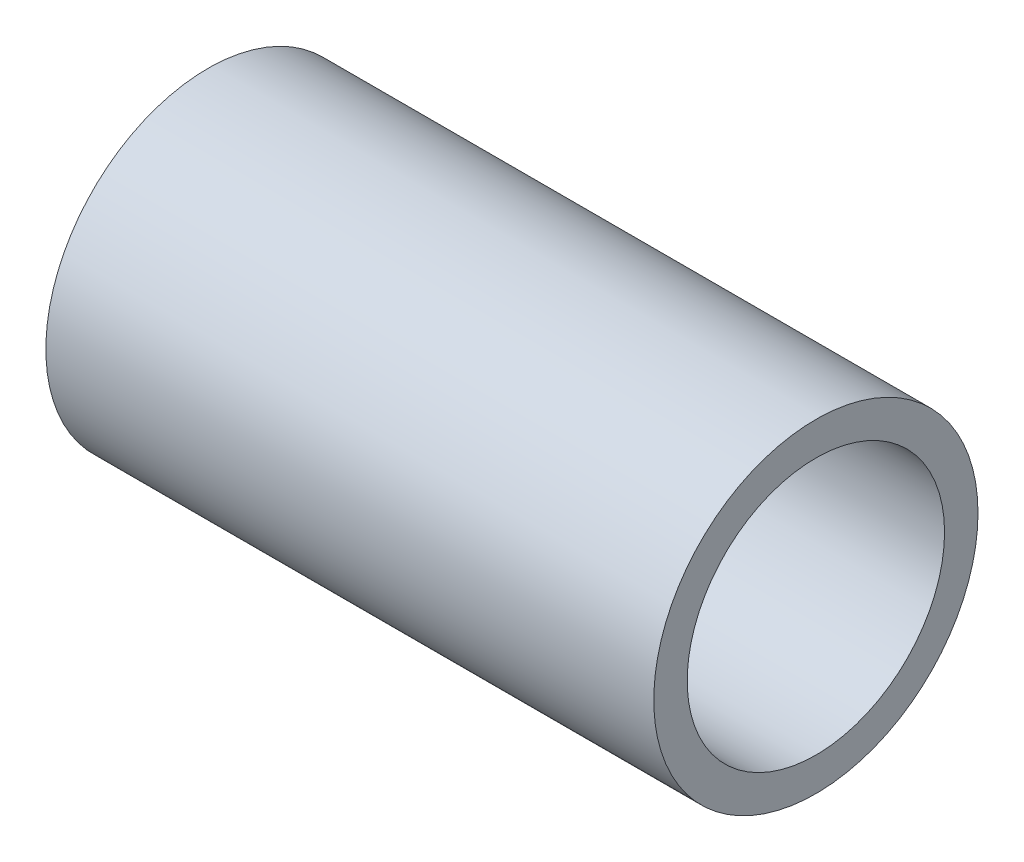
ISO-10303-21;
HEADER;
FILE_DESCRIPTION(('STEP AP214'),'2;1');
FILE_NAME('part.step','',(''),(''),'','','');
FILE_SCHEMA(('AUTOMOTIVE_DESIGN { 1 0 10303 214 1 1 1 1 }'));
ENDSEC;
DATA;
#1=APPLICATION_CONTEXT('core data for automotive mechanical design processes');
#2=APPLICATION_PROTOCOL_DEFINITION('international standard','automotive_design',2000,#1);
#3=PRODUCT_CONTEXT('',#1,'mechanical');
#4=PRODUCT('Part','Part','',(#3));
#5=PRODUCT_RELATED_PRODUCT_CATEGORY('part','',(#4));
#6=PRODUCT_DEFINITION_FORMATION('','',#4);
#7=PRODUCT_DEFINITION_CONTEXT('part definition',#1,'design');
#8=PRODUCT_DEFINITION('design','',#6,#7);
#9=PRODUCT_DEFINITION_SHAPE('','',#8);
#10=(LENGTH_UNIT() NAMED_UNIT(*) SI_UNIT(.MILLI.,.METRE.));
#11=(NAMED_UNIT(*) PLANE_ANGLE_UNIT() SI_UNIT($,.RADIAN.));
#12=(NAMED_UNIT(*) SI_UNIT($,.STERADIAN.) SOLID_ANGLE_UNIT());
#13=UNCERTAINTY_MEASURE_WITH_UNIT(LENGTH_MEASURE(1.E-05),#10,'distance_accuracy_value','');
#14=(GEOMETRIC_REPRESENTATION_CONTEXT(3) GLOBAL_UNCERTAINTY_ASSIGNED_CONTEXT((#13)) GLOBAL_UNIT_ASSIGNED_CONTEXT((#10,
#11,#12)) REPRESENTATION_CONTEXT('',''));
#15=CARTESIAN_POINT('',(0.,0.,0.));
#16=DIRECTION('',(0.,0.,1.));
#17=DIRECTION('',(1.,0.,0.));
#18=AXIS2_PLACEMENT_3D('',#15,#16,#17);
#19=CARTESIAN_POINT('',(7.5,0.,0.));
#20=DIRECTION('',(1.,0.,0.));
#21=DIRECTION('',(0.,0.,-1.));
#22=AXIS2_PLACEMENT_3D('',#19,#20,#21);
#23=PLANE('',#22);
#24=CARTESIAN_POINT('',(7.5,0.,0.));
#25=DIRECTION('',(1.,0.,0.));
#26=DIRECTION('',(0.,0.,-1.));
#27=AXIS2_PLACEMENT_3D('',#24,#25,#26);
#28=CIRCLE('',#27,2.);
#29=CARTESIAN_POINT('',(7.5,0.,-2.));
#30=VERTEX_POINT('',#29);
#31=EDGE_CURVE('E10',#30,#30,#28,.T.);
#32=ORIENTED_EDGE('',*,*,#31,.T.);
#33=EDGE_LOOP('',(#32));
#34=FACE_BOUND('',#33,.T.);
#35=CARTESIAN_POINT('',(7.5,0.,0.));
#36=DIRECTION('',(1.,0.,0.));
#37=DIRECTION('',(0.,0.,-1.));
#38=AXIS2_PLACEMENT_3D('',#35,#36,#37);
#39=CIRCLE('',#38,1.5875);
#40=CARTESIAN_POINT('',(7.5,0.,-1.5875));
#41=VERTEX_POINT('',#40);
#42=EDGE_CURVE('E42',#41,#41,#39,.T.);
#43=ORIENTED_EDGE('',*,*,#42,.F.);
#44=EDGE_LOOP('',(#43));
#45=FACE_BOUND('',#44,.T.);
#46=ADVANCED_FACE('F31',(#34,#45),#23,.T.);
#47=CARTESIAN_POINT('',(0.,0.,0.));
#48=DIRECTION('',(1.,0.,0.));
#49=DIRECTION('',(0.,0.,-1.));
#50=AXIS2_PLACEMENT_3D('',#47,#48,#49);
#51=PLANE('',#50);
#52=CARTESIAN_POINT('',(0.,0.,0.));
#53=DIRECTION('',(1.,0.,0.));
#54=DIRECTION('',(0.,0.,-1.));
#55=AXIS2_PLACEMENT_3D('',#52,#53,#54);
#56=CIRCLE('',#55,2.);
#57=CARTESIAN_POINT('',(0.,0.,-2.));
#58=VERTEX_POINT('',#57);
#59=EDGE_CURVE('E35',#58,#58,#56,.T.);
#60=ORIENTED_EDGE('',*,*,#59,.F.);
#61=EDGE_LOOP('',(#60));
#62=FACE_BOUND('',#61,.T.);
#63=CARTESIAN_POINT('',(0.,0.,0.));
#64=DIRECTION('',(1.,0.,0.));
#65=DIRECTION('',(0.,0.,-1.));
#66=AXIS2_PLACEMENT_3D('',#63,#64,#65);
#67=CIRCLE('',#66,1.5875);
#68=CARTESIAN_POINT('',(0.,0.,-1.5875));
#69=VERTEX_POINT('',#68);
#70=EDGE_CURVE('E44',#69,#69,#67,.T.);
#71=ORIENTED_EDGE('',*,*,#70,.T.);
#72=EDGE_LOOP('',(#71));
#73=FACE_BOUND('',#72,.T.);
#74=ADVANCED_FACE('F54',(#62,#73),#51,.F.);
#75=CARTESIAN_POINT('',(7.5,0.,0.));
#76=DIRECTION('',(-1.,0.,0.));
#77=DIRECTION('',(0.,0.,1.));
#78=AXIS2_PLACEMENT_3D('',#75,#76,#77);
#79=CYLINDRICAL_SURFACE('',#78,2.);
#80=ORIENTED_EDGE('',*,*,#31,.F.);
#81=EDGE_LOOP('',(#80));
#82=FACE_BOUND('',#81,.T.);
#83=ORIENTED_EDGE('',*,*,#59,.T.);
#84=EDGE_LOOP('',(#83));
#85=FACE_BOUND('',#84,.T.);
#86=ADVANCED_FACE('F33',(#82,#85),#79,.T.);
#87=CARTESIAN_POINT('',(7.5,0.,0.));
#88=DIRECTION('',(-1.,0.,0.));
#89=DIRECTION('',(0.,0.,1.));
#90=AXIS2_PLACEMENT_3D('',#87,#88,#89);
#91=CYLINDRICAL_SURFACE('',#90,1.5875);
#92=ORIENTED_EDGE('',*,*,#42,.T.);
#93=EDGE_LOOP('',(#92));
#94=FACE_BOUND('',#93,.T.);
#95=ORIENTED_EDGE('',*,*,#70,.F.);
#96=EDGE_LOOP('',(#95));
#97=FACE_BOUND('',#96,.T.);
#98=ADVANCED_FACE('F50',(#94,#97),#91,.F.);
#99=CLOSED_SHELL('',(#46,#74,#86,#98));
#100=MANIFOLD_SOLID_BREP('B2',#99);
#101=ADVANCED_BREP_SHAPE_REPRESENTATION('',(#18,#100),#14);
#102=SHAPE_DEFINITION_REPRESENTATION(#9,#101);
ENDSEC;
END-ISO-10303-21;
